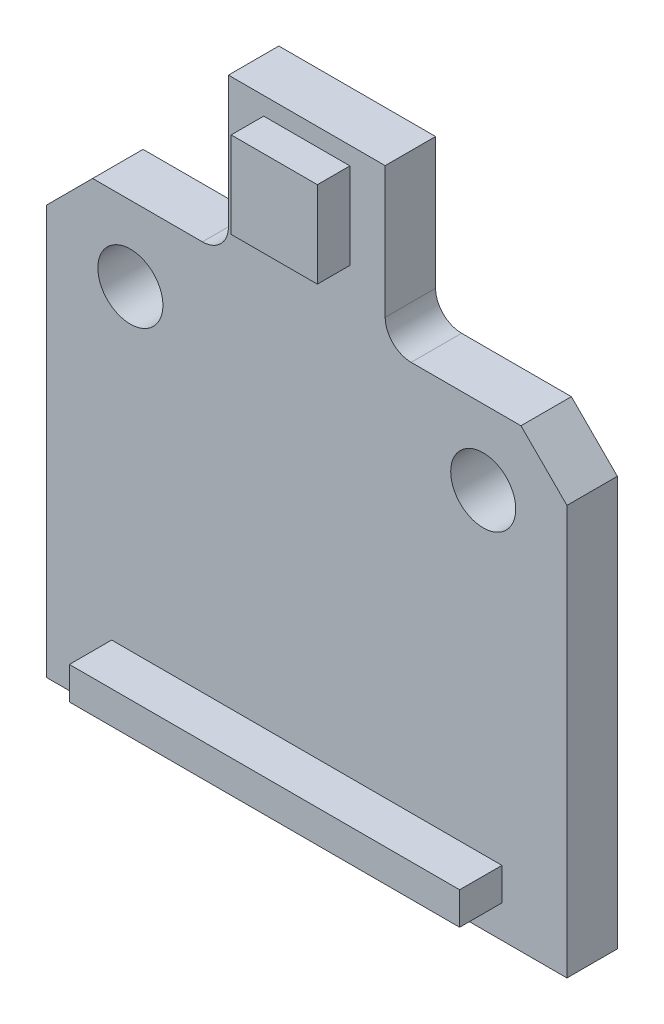
ISO-10303-21;
HEADER;
FILE_DESCRIPTION(('STEP AP214'),'2;1');
FILE_NAME('part.step','',(''),(''),'','','');
FILE_SCHEMA(('AUTOMOTIVE_DESIGN { 1 0 10303 214 1 1 1 1 }'));
ENDSEC;
DATA;
#1=APPLICATION_CONTEXT('core data for automotive mechanical design processes');
#2=APPLICATION_PROTOCOL_DEFINITION('international standard','automotive_design',2000,#1);
#3=PRODUCT_CONTEXT('',#1,'mechanical');
#4=PRODUCT('Part','Part','',(#3));
#5=PRODUCT_RELATED_PRODUCT_CATEGORY('part','',(#4));
#6=PRODUCT_DEFINITION_FORMATION('','',#4);
#7=PRODUCT_DEFINITION_CONTEXT('part definition',#1,'design');
#8=PRODUCT_DEFINITION('design','',#6,#7);
#9=PRODUCT_DEFINITION_SHAPE('','',#8);
#10=(LENGTH_UNIT() NAMED_UNIT(*) SI_UNIT(.MILLI.,.METRE.));
#11=(NAMED_UNIT(*) PLANE_ANGLE_UNIT() SI_UNIT($,.RADIAN.));
#12=(NAMED_UNIT(*) SI_UNIT($,.STERADIAN.) SOLID_ANGLE_UNIT());
#13=UNCERTAINTY_MEASURE_WITH_UNIT(LENGTH_MEASURE(1.E-05),#10,'distance_accuracy_value','');
#14=(GEOMETRIC_REPRESENTATION_CONTEXT(3) GLOBAL_UNCERTAINTY_ASSIGNED_CONTEXT((#13)) GLOBAL_UNIT_ASSIGNED_CONTEXT((#10,
#11,#12)) REPRESENTATION_CONTEXT('',''));
#15=CARTESIAN_POINT('',(0.,0.,0.));
#16=DIRECTION('',(0.,0.,1.));
#17=DIRECTION('',(1.,0.,0.));
#18=AXIS2_PLACEMENT_3D('',#15,#16,#17);
#19=CARTESIAN_POINT('',(4.79,14.8,1.55));
#20=DIRECTION('',(0.,0.,1.));
#21=DIRECTION('',(1.,0.,0.));
#22=AXIS2_PLACEMENT_3D('',#19,#20,#21);
#23=PLANE('',#22);
#24=CARTESIAN_POINT('',(2.575,11.7,1.55));
#25=DIRECTION('',(0.,0.,1.));
#26=DIRECTION('',(1.,0.,0.));
#27=AXIS2_PLACEMENT_3D('',#24,#25,#26);
#28=CIRCLE('',#27,1.);
#29=CARTESIAN_POINT('',(1.575,11.7,1.55));
#30=VERTEX_POINT('',#29);
#31=EDGE_CURVE('E260',#30,#30,#28,.T.);
#32=ORIENTED_EDGE('',*,*,#31,.F.);
#33=EDGE_LOOP('',(#32));
#34=FACE_BOUND('',#33,.T.);
#35=DIRECTION('',(0.,-1.,0.));
#36=VECTOR('',#35,1.);
#37=CARTESIAN_POINT('',(0.,0.,1.55));
#38=LINE('',#37,#36);
#39=CARTESIAN_POINT('',(0.,12.5857864376269,1.55));
#40=VERTEX_POINT('',#39);
#41=CARTESIAN_POINT('',(0.,0.,1.55));
#42=VERTEX_POINT('',#41);
#43=EDGE_CURVE('E268',#40,#42,#38,.T.);
#44=ORIENTED_EDGE('',*,*,#43,.T.);
#45=DIRECTION('',(1.,0.,0.));
#46=VECTOR('',#45,1.);
#47=CARTESIAN_POINT('',(0.,0.,1.55));
#48=LINE('',#47,#46);
#49=CARTESIAN_POINT('',(16.,0.,1.55));
#50=VERTEX_POINT('',#49);
#51=EDGE_CURVE('E272',#42,#50,#48,.T.);
#52=ORIENTED_EDGE('',*,*,#51,.T.);
#53=DIRECTION('',(0.,1.,0.));
#54=VECTOR('',#53,1.);
#55=CARTESIAN_POINT('',(16.,0.,1.55));
#56=LINE('',#55,#54);
#57=CARTESIAN_POINT('',(16.,12.5857864376269,1.55));
#58=VERTEX_POINT('',#57);
#59=EDGE_CURVE('E276',#50,#58,#56,.T.);
#60=ORIENTED_EDGE('',*,*,#59,.T.);
#61=DIRECTION('',(-0.707106781186544,0.707106781186551,0.));
#62=VECTOR('',#61,1.);
#63=CARTESIAN_POINT('',(14.5857864376269,14.,1.55));
#64=LINE('',#63,#62);
#65=CARTESIAN_POINT('',(14.5857864376269,14.,1.55));
#66=VERTEX_POINT('',#65);
#67=EDGE_CURVE('E279',#58,#66,#64,.T.);
#68=ORIENTED_EDGE('',*,*,#67,.T.);
#69=DIRECTION('',(-1.,0.,0.));
#70=VECTOR('',#69,1.);
#71=CARTESIAN_POINT('',(11.21,14.,1.55));
#72=LINE('',#71,#70);
#73=CARTESIAN_POINT('',(11.21,14.,1.55));
#74=VERTEX_POINT('',#73);
#75=EDGE_CURVE('E282',#66,#74,#72,.T.);
#76=ORIENTED_EDGE('',*,*,#75,.T.);
#77=CARTESIAN_POINT('',(11.21,14.8,1.55));
#78=DIRECTION('',(0.,0.,-1.));
#79=DIRECTION('',(-1.,0.,0.));
#80=AXIS2_PLACEMENT_3D('',#77,#78,#79);
#81=CIRCLE('',#80,0.799999999999999);
#82=CARTESIAN_POINT('',(10.41,14.8,1.55));
#83=VERTEX_POINT('',#82);
#84=EDGE_CURVE('E285',#74,#83,#81,.T.);
#85=ORIENTED_EDGE('',*,*,#84,.T.);
#86=DIRECTION('',(0.,1.,0.));
#87=VECTOR('',#86,1.);
#88=CARTESIAN_POINT('',(10.41,14.8,1.55));
#89=LINE('',#88,#87);
#90=CARTESIAN_POINT('',(10.41,18.84,1.55));
#91=VERTEX_POINT('',#90);
#92=EDGE_CURVE('E288',#83,#91,#89,.T.);
#93=ORIENTED_EDGE('',*,*,#92,.T.);
#94=DIRECTION('',(-1.,0.,0.));
#95=VECTOR('',#94,1.);
#96=CARTESIAN_POINT('',(5.59000000000001,18.84,1.55));
#97=LINE('',#96,#95);
#98=CARTESIAN_POINT('',(5.59000000000001,18.84,1.55));
#99=VERTEX_POINT('',#98);
#100=EDGE_CURVE('E291',#91,#99,#97,.T.);
#101=ORIENTED_EDGE('',*,*,#100,.T.);
#102=DIRECTION('',(0.,-1.,0.));
#103=VECTOR('',#102,1.);
#104=CARTESIAN_POINT('',(5.59,14.8,1.55));
#105=LINE('',#104,#103);
#106=CARTESIAN_POINT('',(5.59,14.8,1.55));
#107=VERTEX_POINT('',#106);
#108=EDGE_CURVE('E294',#99,#107,#105,.T.);
#109=ORIENTED_EDGE('',*,*,#108,.T.);
#110=CARTESIAN_POINT('',(4.79,14.8,1.55));
#111=DIRECTION('',(0.,0.,-1.));
#112=DIRECTION('',(1.,0.,0.));
#113=AXIS2_PLACEMENT_3D('',#110,#111,#112);
#114=CIRCLE('',#113,0.8);
#115=CARTESIAN_POINT('',(4.79,14.,1.55));
#116=VERTEX_POINT('',#115);
#117=EDGE_CURVE('E297',#107,#116,#114,.T.);
#118=ORIENTED_EDGE('',*,*,#117,.T.);
#119=DIRECTION('',(-1.,0.,0.));
#120=VECTOR('',#119,1.);
#121=CARTESIAN_POINT('',(1.4142135623731,14.,1.55));
#122=LINE('',#121,#120);
#123=CARTESIAN_POINT('',(1.4142135623731,14.,1.55));
#124=VERTEX_POINT('',#123);
#125=EDGE_CURVE('E300',#116,#124,#122,.T.);
#126=ORIENTED_EDGE('',*,*,#125,.T.);
#127=DIRECTION('',(-0.707106781186548,-0.707106781186547,0.));
#128=VECTOR('',#127,1.);
#129=CARTESIAN_POINT('',(0.,12.5857864376269,1.55));
#130=LINE('',#129,#128);
#131=EDGE_CURVE('E303',#124,#40,#130,.T.);
#132=ORIENTED_EDGE('',*,*,#131,.T.);
#133=EDGE_LOOP('',(#44,#52,#60,#68,#76,#85,#93,#101,#109,#118,#126,#132));
#134=FACE_BOUND('',#133,.T.);
#135=CARTESIAN_POINT('',(13.425,11.7,1.55));
#136=DIRECTION('',(0.,0.,1.));
#137=DIRECTION('',(1.,0.,0.));
#138=AXIS2_PLACEMENT_3D('',#135,#136,#137);
#139=CIRCLE('',#138,1.);
#140=CARTESIAN_POINT('',(12.425,11.7,1.55));
#141=VERTEX_POINT('',#140);
#142=EDGE_CURVE('E252',#141,#141,#139,.T.);
#143=ORIENTED_EDGE('',*,*,#142,.F.);
#144=EDGE_LOOP('',(#143));
#145=FACE_BOUND('',#144,.T.);
#146=DIRECTION('',(1.,0.,0.));
#147=VECTOR('',#146,1.);
#148=CARTESIAN_POINT('',(6.67500000000001,15.64,1.55));
#149=LINE('',#148,#147);
#150=CARTESIAN_POINT('',(6.67500000000001,15.64,1.55));
#151=VERTEX_POINT('',#150);
#152=CARTESIAN_POINT('',(9.32500000000001,15.64,1.55));
#153=VERTEX_POINT('',#152);
#154=EDGE_CURVE('E212',#151,#153,#149,.T.);
#155=ORIENTED_EDGE('',*,*,#154,.F.);
#156=DIRECTION('',(0.,-1.,0.));
#157=VECTOR('',#156,1.);
#158=CARTESIAN_POINT('',(6.67500000000001,18.29,1.55));
#159=LINE('',#158,#157);
#160=CARTESIAN_POINT('',(6.67500000000001,18.29,1.55));
#161=VERTEX_POINT('',#160);
#162=EDGE_CURVE('E207',#161,#151,#159,.T.);
#163=ORIENTED_EDGE('',*,*,#162,.F.);
#164=DIRECTION('',(-1.,0.,0.));
#165=VECTOR('',#164,1.);
#166=CARTESIAN_POINT('',(6.67500000000001,18.29,1.55));
#167=LINE('',#166,#165);
#168=CARTESIAN_POINT('',(9.32500000000001,18.29,1.55));
#169=VERTEX_POINT('',#168);
#170=EDGE_CURVE('E222',#169,#161,#167,.T.);
#171=ORIENTED_EDGE('',*,*,#170,.F.);
#172=DIRECTION('',(0.,1.,0.));
#173=VECTOR('',#172,1.);
#174=CARTESIAN_POINT('',(9.32500000000001,18.29,1.55));
#175=LINE('',#174,#173);
#176=EDGE_CURVE('E234',#153,#169,#175,.T.);
#177=ORIENTED_EDGE('',*,*,#176,.F.);
#178=EDGE_LOOP('',(#155,#163,#171,#177));
#179=FACE_BOUND('',#178,.T.);
#180=DIRECTION('',(1.,0.,0.));
#181=VECTOR('',#180,1.);
#182=CARTESIAN_POINT('',(2.,1.,1.55));
#183=LINE('',#182,#181);
#184=CARTESIAN_POINT('',(2.,1.,1.55));
#185=VERTEX_POINT('',#184);
#186=CARTESIAN_POINT('',(14.,1.,1.55));
#187=VERTEX_POINT('',#186);
#188=EDGE_CURVE('E677',#185,#187,#183,.T.);
#189=ORIENTED_EDGE('',*,*,#188,.F.);
#190=DIRECTION('',(0.,-1.,0.));
#191=VECTOR('',#190,1.);
#192=CARTESIAN_POINT('',(2.,2.,1.55));
#193=LINE('',#192,#191);
#194=CARTESIAN_POINT('',(2.,2.,1.55));
#195=VERTEX_POINT('',#194);
#196=EDGE_CURVE('E204',#195,#185,#193,.T.);
#197=ORIENTED_EDGE('',*,*,#196,.F.);
#198=DIRECTION('',(-1.,0.,0.));
#199=VECTOR('',#198,1.);
#200=CARTESIAN_POINT('',(2.,2.,1.55));
#201=LINE('',#200,#199);
#202=CARTESIAN_POINT('',(14.,2.,1.55));
#203=VERTEX_POINT('',#202);
#204=EDGE_CURVE('E200',#203,#195,#201,.T.);
#205=ORIENTED_EDGE('',*,*,#204,.F.);
#206=DIRECTION('',(0.,1.,0.));
#207=VECTOR('',#206,1.);
#208=CARTESIAN_POINT('',(14.,2.,1.55));
#209=LINE('',#208,#207);
#210=EDGE_CURVE('E673',#187,#203,#209,.T.);
#211=ORIENTED_EDGE('',*,*,#210,.F.);
#212=EDGE_LOOP('',(#189,#197,#205,#211));
#213=FACE_BOUND('',#212,.T.);
#214=ADVANCED_FACE('F40',(#34,#134,#145,#179,#213),#23,.T.);
#215=CARTESIAN_POINT('',(4.79,14.8,0.));
#216=DIRECTION('',(0.,0.,1.));
#217=DIRECTION('',(1.,0.,0.));
#218=AXIS2_PLACEMENT_3D('',#215,#216,#217);
#219=PLANE('',#218);
#220=DIRECTION('',(0.,-1.,0.));
#221=VECTOR('',#220,1.);
#222=CARTESIAN_POINT('',(0.,0.,0.));
#223=LINE('',#222,#221);
#224=CARTESIAN_POINT('',(0.,12.5857864376269,0.));
#225=VERTEX_POINT('',#224);
#226=CARTESIAN_POINT('',(0.,0.,0.));
#227=VERTEX_POINT('',#226);
#228=EDGE_CURVE('E264',#225,#227,#223,.T.);
#229=ORIENTED_EDGE('',*,*,#228,.F.);
#230=DIRECTION('',(-0.707106781186548,-0.707106781186547,0.));
#231=VECTOR('',#230,1.);
#232=CARTESIAN_POINT('',(0.,12.5857864376269,0.));
#233=LINE('',#232,#231);
#234=CARTESIAN_POINT('',(1.4142135623731,14.,0.));
#235=VERTEX_POINT('',#234);
#236=EDGE_CURVE('E273',#235,#225,#233,.T.);
#237=ORIENTED_EDGE('',*,*,#236,.F.);
#238=DIRECTION('',(-1.,0.,0.));
#239=VECTOR('',#238,1.);
#240=CARTESIAN_POINT('',(1.4142135623731,14.,0.));
#241=LINE('',#240,#239);
#242=CARTESIAN_POINT('',(4.79,14.,0.));
#243=VERTEX_POINT('',#242);
#244=EDGE_CURVE('E337',#243,#235,#241,.T.);
#245=ORIENTED_EDGE('',*,*,#244,.F.);
#246=CARTESIAN_POINT('',(4.79,14.8,0.));
#247=DIRECTION('',(0.,0.,-1.));
#248=DIRECTION('',(1.,0.,0.));
#249=AXIS2_PLACEMENT_3D('',#246,#247,#248);
#250=CIRCLE('',#249,0.8);
#251=CARTESIAN_POINT('',(5.59,14.8,0.));
#252=VERTEX_POINT('',#251);
#253=EDGE_CURVE('E334',#252,#243,#250,.T.);
#254=ORIENTED_EDGE('',*,*,#253,.F.);
#255=DIRECTION('',(0.,-1.,0.));
#256=VECTOR('',#255,1.);
#257=CARTESIAN_POINT('',(5.59,14.8,0.));
#258=LINE('',#257,#256);
#259=CARTESIAN_POINT('',(5.59000000000001,18.84,0.));
#260=VERTEX_POINT('',#259);
#261=EDGE_CURVE('E331',#260,#252,#258,.T.);
#262=ORIENTED_EDGE('',*,*,#261,.F.);
#263=DIRECTION('',(-1.,0.,0.));
#264=VECTOR('',#263,1.);
#265=CARTESIAN_POINT('',(5.59000000000001,18.84,0.));
#266=LINE('',#265,#264);
#267=CARTESIAN_POINT('',(10.41,18.84,0.));
#268=VERTEX_POINT('',#267);
#269=EDGE_CURVE('E328',#268,#260,#266,.T.);
#270=ORIENTED_EDGE('',*,*,#269,.F.);
#271=DIRECTION('',(0.,1.,0.));
#272=VECTOR('',#271,1.);
#273=CARTESIAN_POINT('',(10.41,14.8,0.));
#274=LINE('',#273,#272);
#275=CARTESIAN_POINT('',(10.41,14.8,0.));
#276=VERTEX_POINT('',#275);
#277=EDGE_CURVE('E325',#276,#268,#274,.T.);
#278=ORIENTED_EDGE('',*,*,#277,.F.);
#279=CARTESIAN_POINT('',(11.21,14.8,0.));
#280=DIRECTION('',(0.,0.,-1.));
#281=DIRECTION('',(-1.,0.,0.));
#282=AXIS2_PLACEMENT_3D('',#279,#280,#281);
#283=CIRCLE('',#282,0.799999999999999);
#284=CARTESIAN_POINT('',(11.21,14.,0.));
#285=VERTEX_POINT('',#284);
#286=EDGE_CURVE('E322',#285,#276,#283,.T.);
#287=ORIENTED_EDGE('',*,*,#286,.F.);
#288=DIRECTION('',(-1.,0.,0.));
#289=VECTOR('',#288,1.);
#290=CARTESIAN_POINT('',(11.21,14.,0.));
#291=LINE('',#290,#289);
#292=CARTESIAN_POINT('',(14.5857864376269,14.,0.));
#293=VERTEX_POINT('',#292);
#294=EDGE_CURVE('E319',#293,#285,#291,.T.);
#295=ORIENTED_EDGE('',*,*,#294,.F.);
#296=DIRECTION('',(-0.707106781186544,0.707106781186551,0.));
#297=VECTOR('',#296,1.);
#298=CARTESIAN_POINT('',(14.5857864376269,14.,0.));
#299=LINE('',#298,#297);
#300=CARTESIAN_POINT('',(16.,12.5857864376269,0.));
#301=VERTEX_POINT('',#300);
#302=EDGE_CURVE('E316',#301,#293,#299,.T.);
#303=ORIENTED_EDGE('',*,*,#302,.F.);
#304=DIRECTION('',(0.,1.,0.));
#305=VECTOR('',#304,1.);
#306=CARTESIAN_POINT('',(16.,0.,0.));
#307=LINE('',#306,#305);
#308=CARTESIAN_POINT('',(16.,0.,0.));
#309=VERTEX_POINT('',#308);
#310=EDGE_CURVE('E313',#309,#301,#307,.T.);
#311=ORIENTED_EDGE('',*,*,#310,.F.);
#312=DIRECTION('',(1.,0.,0.));
#313=VECTOR('',#312,1.);
#314=CARTESIAN_POINT('',(0.,0.,0.));
#315=LINE('',#314,#313);
#316=EDGE_CURVE('E310',#227,#309,#315,.T.);
#317=ORIENTED_EDGE('',*,*,#316,.F.);
#318=EDGE_LOOP('',(#229,#237,#245,#254,#262,#270,#278,#287,#295,#303,#311,#317));
#319=FACE_BOUND('',#318,.T.);
#320=CARTESIAN_POINT('',(2.575,11.7,0.));
#321=DIRECTION('',(0.,0.,1.));
#322=DIRECTION('',(1.,0.,0.));
#323=AXIS2_PLACEMENT_3D('',#320,#321,#322);
#324=CIRCLE('',#323,1.);
#325=CARTESIAN_POINT('',(1.575,11.7,0.));
#326=VERTEX_POINT('',#325);
#327=EDGE_CURVE('E256',#326,#326,#324,.T.);
#328=ORIENTED_EDGE('',*,*,#327,.T.);
#329=EDGE_LOOP('',(#328));
#330=FACE_BOUND('',#329,.T.);
#331=CARTESIAN_POINT('',(13.425,11.7,0.));
#332=DIRECTION('',(0.,0.,1.));
#333=DIRECTION('',(1.,0.,0.));
#334=AXIS2_PLACEMENT_3D('',#331,#332,#333);
#335=CIRCLE('',#334,1.);
#336=CARTESIAN_POINT('',(12.425,11.7,0.));
#337=VERTEX_POINT('',#336);
#338=EDGE_CURVE('E251',#337,#337,#335,.T.);
#339=ORIENTED_EDGE('',*,*,#338,.T.);
#340=EDGE_LOOP('',(#339));
#341=FACE_BOUND('',#340,.T.);
#342=ADVANCED_FACE('F392',(#319,#330,#341),#219,.F.);
#343=CARTESIAN_POINT('',(0.,0.,1.55));
#344=DIRECTION('',(1.,0.,0.));
#345=DIRECTION('',(0.,0.,-1.));
#346=AXIS2_PLACEMENT_3D('',#343,#344,#345);
#347=PLANE('',#346);
#348=ORIENTED_EDGE('',*,*,#228,.T.);
#349=DIRECTION('',(0.,0.,-1.));
#350=VECTOR('',#349,1.);
#351=CARTESIAN_POINT('',(0.,0.,1.55));
#352=LINE('',#351,#350);
#353=EDGE_CURVE('E11',#42,#227,#352,.T.);
#354=ORIENTED_EDGE('',*,*,#353,.F.);
#355=ORIENTED_EDGE('',*,*,#43,.F.);
#356=DIRECTION('',(0.,0.,-1.));
#357=VECTOR('',#356,1.);
#358=CARTESIAN_POINT('',(0.,12.5857864376269,1.55));
#359=LINE('',#358,#357);
#360=EDGE_CURVE('E306',#40,#225,#359,.T.);
#361=ORIENTED_EDGE('',*,*,#360,.T.);
#362=EDGE_LOOP('',(#348,#354,#355,#361));
#363=FACE_BOUND('',#362,.T.);
#364=ADVANCED_FACE('F42',(#363),#347,.F.);
#365=CARTESIAN_POINT('',(0.,0.,1.55));
#366=DIRECTION('',(0.,1.,0.));
#367=DIRECTION('',(0.,0.,1.));
#368=AXIS2_PLACEMENT_3D('',#365,#366,#367);
#369=PLANE('',#368);
#370=ORIENTED_EDGE('',*,*,#316,.T.);
#371=DIRECTION('',(0.,0.,-1.));
#372=VECTOR('',#371,1.);
#373=CARTESIAN_POINT('',(16.,0.,1.55));
#374=LINE('',#373,#372);
#375=EDGE_CURVE('E49',#50,#309,#374,.T.);
#376=ORIENTED_EDGE('',*,*,#375,.F.);
#377=ORIENTED_EDGE('',*,*,#51,.F.);
#378=ORIENTED_EDGE('',*,*,#353,.T.);
#379=EDGE_LOOP('',(#370,#376,#377,#378));
#380=FACE_BOUND('',#379,.T.);
#381=ADVANCED_FACE('F410',(#380),#369,.F.);
#382=CARTESIAN_POINT('',(16.,0.,1.55));
#383=DIRECTION('',(-1.,0.,0.));
#384=DIRECTION('',(0.,0.,1.));
#385=AXIS2_PLACEMENT_3D('',#382,#383,#384);
#386=PLANE('',#385);
#387=ORIENTED_EDGE('',*,*,#310,.T.);
#388=DIRECTION('',(0.,0.,-1.));
#389=VECTOR('',#388,1.);
#390=CARTESIAN_POINT('',(16.,12.5857864376269,1.55));
#391=LINE('',#390,#389);
#392=EDGE_CURVE('E377',#58,#301,#391,.T.);
#393=ORIENTED_EDGE('',*,*,#392,.F.);
#394=ORIENTED_EDGE('',*,*,#59,.F.);
#395=ORIENTED_EDGE('',*,*,#375,.T.);
#396=EDGE_LOOP('',(#387,#393,#394,#395));
#397=FACE_BOUND('',#396,.T.);
#398=ADVANCED_FACE('F386',(#397),#386,.F.);
#399=CARTESIAN_POINT('',(14.5857864376269,14.,1.55));
#400=DIRECTION('',(-0.707106781186551,-0.707106781186544,0.));
#401=DIRECTION('',(0.707106781186544,-0.707106781186551,0.));
#402=AXIS2_PLACEMENT_3D('',#399,#400,#401);
#403=PLANE('',#402);
#404=ORIENTED_EDGE('',*,*,#302,.T.);
#405=DIRECTION('',(0.,0.,-1.));
#406=VECTOR('',#405,1.);
#407=CARTESIAN_POINT('',(14.5857864376269,14.,1.55));
#408=LINE('',#407,#406);
#409=EDGE_CURVE('E373',#66,#293,#408,.T.);
#410=ORIENTED_EDGE('',*,*,#409,.F.);
#411=ORIENTED_EDGE('',*,*,#67,.F.);
#412=ORIENTED_EDGE('',*,*,#392,.T.);
#413=EDGE_LOOP('',(#404,#410,#411,#412));
#414=FACE_BOUND('',#413,.T.);
#415=ADVANCED_FACE('F398',(#414),#403,.F.);
#416=CARTESIAN_POINT('',(11.21,14.,1.55));
#417=DIRECTION('',(0.,-1.,0.));
#418=DIRECTION('',(0.,0.,-1.));
#419=AXIS2_PLACEMENT_3D('',#416,#417,#418);
#420=PLANE('',#419);
#421=ORIENTED_EDGE('',*,*,#294,.T.);
#422=DIRECTION('',(0.,0.,-1.));
#423=VECTOR('',#422,1.);
#424=CARTESIAN_POINT('',(11.21,14.,1.55));
#425=LINE('',#424,#423);
#426=EDGE_CURVE('E369',#74,#285,#425,.T.);
#427=ORIENTED_EDGE('',*,*,#426,.F.);
#428=ORIENTED_EDGE('',*,*,#75,.F.);
#429=ORIENTED_EDGE('',*,*,#409,.T.);
#430=EDGE_LOOP('',(#421,#427,#428,#429));
#431=FACE_BOUND('',#430,.T.);
#432=ADVANCED_FACE('F402',(#431),#420,.F.);
#433=CARTESIAN_POINT('',(11.21,14.8,1.55));
#434=DIRECTION('',(0.,0.,-1.));
#435=DIRECTION('',(-1.,0.,0.));
#436=AXIS2_PLACEMENT_3D('',#433,#434,#435);
#437=CYLINDRICAL_SURFACE('',#436,0.799999999999999);
#438=ORIENTED_EDGE('',*,*,#286,.T.);
#439=DIRECTION('',(0.,0.,-1.));
#440=VECTOR('',#439,1.);
#441=CARTESIAN_POINT('',(10.41,14.8,1.55));
#442=LINE('',#441,#440);
#443=EDGE_CURVE('E365',#83,#276,#442,.T.);
#444=ORIENTED_EDGE('',*,*,#443,.F.);
#445=ORIENTED_EDGE('',*,*,#84,.F.);
#446=ORIENTED_EDGE('',*,*,#426,.T.);
#447=EDGE_LOOP('',(#438,#444,#445,#446));
#448=FACE_BOUND('',#447,.T.);
#449=ADVANCED_FACE('F443',(#448),#437,.F.);
#450=CARTESIAN_POINT('',(10.41,14.8,1.55));
#451=DIRECTION('',(-1.,0.,0.));
#452=DIRECTION('',(0.,-1.,0.));
#453=AXIS2_PLACEMENT_3D('',#450,#451,#452);
#454=PLANE('',#453);
#455=ORIENTED_EDGE('',*,*,#277,.T.);
#456=DIRECTION('',(0.,0.,-1.));
#457=VECTOR('',#456,1.);
#458=CARTESIAN_POINT('',(10.41,18.84,1.55));
#459=LINE('',#458,#457);
#460=EDGE_CURVE('E361',#91,#268,#459,.T.);
#461=ORIENTED_EDGE('',*,*,#460,.F.);
#462=ORIENTED_EDGE('',*,*,#92,.F.);
#463=ORIENTED_EDGE('',*,*,#443,.T.);
#464=EDGE_LOOP('',(#455,#461,#462,#463));
#465=FACE_BOUND('',#464,.T.);
#466=ADVANCED_FACE('F441',(#465),#454,.F.);
#467=CARTESIAN_POINT('',(5.59000000000001,18.84,1.55));
#468=DIRECTION('',(0.,-1.,0.));
#469=DIRECTION('',(0.,0.,-1.));
#470=AXIS2_PLACEMENT_3D('',#467,#468,#469);
#471=PLANE('',#470);
#472=ORIENTED_EDGE('',*,*,#269,.T.);
#473=DIRECTION('',(0.,0.,-1.));
#474=VECTOR('',#473,1.);
#475=CARTESIAN_POINT('',(5.59000000000001,18.84,1.55));
#476=LINE('',#475,#474);
#477=EDGE_CURVE('E357',#99,#260,#476,.T.);
#478=ORIENTED_EDGE('',*,*,#477,.F.);
#479=ORIENTED_EDGE('',*,*,#100,.F.);
#480=ORIENTED_EDGE('',*,*,#460,.T.);
#481=EDGE_LOOP('',(#472,#478,#479,#480));
#482=FACE_BOUND('',#481,.T.);
#483=ADVANCED_FACE('F437',(#482),#471,.F.);
#484=CARTESIAN_POINT('',(5.59,14.8,1.55));
#485=DIRECTION('',(1.,0.,0.));
#486=DIRECTION('',(0.,1.,0.));
#487=AXIS2_PLACEMENT_3D('',#484,#485,#486);
#488=PLANE('',#487);
#489=ORIENTED_EDGE('',*,*,#261,.T.);
#490=DIRECTION('',(0.,0.,-1.));
#491=VECTOR('',#490,1.);
#492=CARTESIAN_POINT('',(5.59,14.8,1.55));
#493=LINE('',#492,#491);
#494=EDGE_CURVE('E353',#107,#252,#493,.T.);
#495=ORIENTED_EDGE('',*,*,#494,.F.);
#496=ORIENTED_EDGE('',*,*,#108,.F.);
#497=ORIENTED_EDGE('',*,*,#477,.T.);
#498=EDGE_LOOP('',(#489,#495,#496,#497));
#499=FACE_BOUND('',#498,.T.);
#500=ADVANCED_FACE('F432',(#499),#488,.F.);
#501=CARTESIAN_POINT('',(4.79,14.8,1.55));
#502=DIRECTION('',(0.,0.,-1.));
#503=DIRECTION('',(-1.,0.,0.));
#504=AXIS2_PLACEMENT_3D('',#501,#502,#503);
#505=CYLINDRICAL_SURFACE('',#504,0.8);
#506=ORIENTED_EDGE('',*,*,#253,.T.);
#507=DIRECTION('',(0.,0.,-1.));
#508=VECTOR('',#507,1.);
#509=CARTESIAN_POINT('',(4.79,14.,1.55));
#510=LINE('',#509,#508);
#511=EDGE_CURVE('E349',#116,#243,#510,.T.);
#512=ORIENTED_EDGE('',*,*,#511,.F.);
#513=ORIENTED_EDGE('',*,*,#117,.F.);
#514=ORIENTED_EDGE('',*,*,#494,.T.);
#515=EDGE_LOOP('',(#506,#512,#513,#514));
#516=FACE_BOUND('',#515,.T.);
#517=ADVANCED_FACE('F426',(#516),#505,.F.);
#518=CARTESIAN_POINT('',(1.4142135623731,14.,1.55));
#519=DIRECTION('',(0.,-1.,0.));
#520=DIRECTION('',(1.,0.,0.));
#521=AXIS2_PLACEMENT_3D('',#518,#519,#520);
#522=PLANE('',#521);
#523=ORIENTED_EDGE('',*,*,#244,.T.);
#524=DIRECTION('',(0.,0.,-1.));
#525=VECTOR('',#524,1.);
#526=CARTESIAN_POINT('',(1.4142135623731,14.,1.55));
#527=LINE('',#526,#525);
#528=EDGE_CURVE('E345',#124,#235,#527,.T.);
#529=ORIENTED_EDGE('',*,*,#528,.F.);
#530=ORIENTED_EDGE('',*,*,#125,.F.);
#531=ORIENTED_EDGE('',*,*,#511,.T.);
#532=EDGE_LOOP('',(#523,#529,#530,#531));
#533=FACE_BOUND('',#532,.T.);
#534=ADVANCED_FACE('F422',(#533),#522,.F.);
#535=CARTESIAN_POINT('',(0.,12.5857864376269,1.55));
#536=DIRECTION('',(0.707106781186547,-0.707106781186548,0.));
#537=DIRECTION('',(0.707106781186548,0.707106781186547,0.));
#538=AXIS2_PLACEMENT_3D('',#535,#536,#537);
#539=PLANE('',#538);
#540=ORIENTED_EDGE('',*,*,#236,.T.);
#541=ORIENTED_EDGE('',*,*,#360,.F.);
#542=ORIENTED_EDGE('',*,*,#131,.F.);
#543=ORIENTED_EDGE('',*,*,#528,.T.);
#544=EDGE_LOOP('',(#540,#541,#542,#543));
#545=FACE_BOUND('',#544,.T.);
#546=ADVANCED_FACE('F417',(#545),#539,.F.);
#547=CARTESIAN_POINT('',(2.575,11.7,1.55));
#548=DIRECTION('',(0.,0.,-1.));
#549=DIRECTION('',(-1.,0.,0.));
#550=AXIS2_PLACEMENT_3D('',#547,#548,#549);
#551=CYLINDRICAL_SURFACE('',#550,1.);
#552=CARTESIAN_POINT('',(1.575,11.7,1.55));
#553=CARTESIAN_POINT('',(1.575,11.7,1.53385416666667));
#554=CARTESIAN_POINT('',(1.575,11.7,1.51770833333333));
#555=CARTESIAN_POINT('',(1.575,11.7,1.48541666666667));
#556=CARTESIAN_POINT('',(1.575,11.7,1.46927083333333));
#557=CARTESIAN_POINT('',(1.575,11.7,1.43697916666667));
#558=CARTESIAN_POINT('',(1.575,11.7,1.42083333333333));
#559=CARTESIAN_POINT('',(1.575,11.7,1.38854166666667));
#560=CARTESIAN_POINT('',(1.575,11.7,1.37239583333333));
#561=CARTESIAN_POINT('',(1.575,11.7,1.34010416666667));
#562=CARTESIAN_POINT('',(1.575,11.7,1.32395833333333));
#563=CARTESIAN_POINT('',(1.575,11.7,1.29166666666667));
#564=CARTESIAN_POINT('',(1.575,11.7,1.27552083333333));
#565=CARTESIAN_POINT('',(1.575,11.7,1.24322916666667));
#566=CARTESIAN_POINT('',(1.575,11.7,1.22708333333333));
#567=CARTESIAN_POINT('',(1.575,11.7,1.19479166666667));
#568=CARTESIAN_POINT('',(1.575,11.7,1.17864583333333));
#569=CARTESIAN_POINT('',(1.575,11.7,1.14635416666667));
#570=CARTESIAN_POINT('',(1.575,11.7,1.13020833333333));
#571=CARTESIAN_POINT('',(1.575,11.7,1.09791666666667));
#572=CARTESIAN_POINT('',(1.575,11.7,1.08177083333333));
#573=CARTESIAN_POINT('',(1.575,11.7,1.04947916666667));
#574=CARTESIAN_POINT('',(1.575,11.7,1.03333333333333));
#575=CARTESIAN_POINT('',(1.575,11.7,1.00104166666667));
#576=CARTESIAN_POINT('',(1.575,11.7,0.984895833333333));
#577=CARTESIAN_POINT('',(1.575,11.7,0.952604166666667));
#578=CARTESIAN_POINT('',(1.575,11.7,0.936458333333333));
#579=CARTESIAN_POINT('',(1.575,11.7,0.904166666666667));
#580=CARTESIAN_POINT('',(1.575,11.7,0.888020833333333));
#581=CARTESIAN_POINT('',(1.575,11.7,0.855729166666667));
#582=CARTESIAN_POINT('',(1.575,11.7,0.839583333333333));
#583=CARTESIAN_POINT('',(1.575,11.7,0.807291666666667));
#584=CARTESIAN_POINT('',(1.575,11.7,0.791145833333333));
#585=CARTESIAN_POINT('',(1.575,11.7,0.758854166666667));
#586=CARTESIAN_POINT('',(1.575,11.7,0.742708333333333));
#587=CARTESIAN_POINT('',(1.575,11.7,0.710416666666667));
#588=CARTESIAN_POINT('',(1.575,11.7,0.694270833333333));
#589=CARTESIAN_POINT('',(1.575,11.7,0.661979166666667));
#590=CARTESIAN_POINT('',(1.575,11.7,0.645833333333333));
#591=CARTESIAN_POINT('',(1.575,11.7,0.613541666666667));
#592=CARTESIAN_POINT('',(1.575,11.7,0.597395833333333));
#593=CARTESIAN_POINT('',(1.575,11.7,0.565104166666667));
#594=CARTESIAN_POINT('',(1.575,11.7,0.548958333333333));
#595=CARTESIAN_POINT('',(1.575,11.7,0.516666666666667));
#596=CARTESIAN_POINT('',(1.575,11.7,0.500520833333333));
#597=CARTESIAN_POINT('',(1.575,11.7,0.468229166666667));
#598=CARTESIAN_POINT('',(1.575,11.7,0.452083333333333));
#599=CARTESIAN_POINT('',(1.575,11.7,0.419791666666667));
#600=CARTESIAN_POINT('',(1.575,11.7,0.403645833333333));
#601=CARTESIAN_POINT('',(1.575,11.7,0.371354166666667));
#602=CARTESIAN_POINT('',(1.575,11.7,0.355208333333333));
#603=CARTESIAN_POINT('',(1.575,11.7,0.322916666666667));
#604=CARTESIAN_POINT('',(1.575,11.7,0.306770833333333));
#605=CARTESIAN_POINT('',(1.575,11.7,0.274479166666667));
#606=CARTESIAN_POINT('',(1.575,11.7,0.258333333333333));
#607=CARTESIAN_POINT('',(1.575,11.7,0.226041666666667));
#608=CARTESIAN_POINT('',(1.575,11.7,0.209895833333333));
#609=CARTESIAN_POINT('',(1.575,11.7,0.177604166666667));
#610=CARTESIAN_POINT('',(1.575,11.7,0.161458333333333));
#611=CARTESIAN_POINT('',(1.575,11.7,0.129166666666667));
#612=CARTESIAN_POINT('',(1.575,11.7,0.113020833333333));
#613=CARTESIAN_POINT('',(1.575,11.7,0.0807291666666667));
#614=CARTESIAN_POINT('',(1.575,11.7,0.0645833333333334));
#615=CARTESIAN_POINT('',(1.575,11.7,0.0322916666666667));
#616=CARTESIAN_POINT('',(1.575,11.7,0.0161458333333334));
#617=CARTESIAN_POINT('',(1.575,11.7,0.));
#618=B_SPLINE_CURVE_WITH_KNOTS('',3,(#552,#553,#554,#555,#556,#557,#558,#559,#560,#561,#562,
#563,#564,#565,#566,#567,#568,#569,#570,#571,#572,#573,#574,#575,#576,#577,#578,#579,#580,#581,
#582,#583,#584,#585,#586,#587,#588,#589,#590,#591,#592,#593,#594,#595,#596,#597,#598,#599,#600,
#601,#602,#603,#604,#605,#606,#607,#608,#609,#610,#611,#612,#613,#614,#615,#616,#617),
.UNSPECIFIED.,.F.,.F.,(4,2,2,2,2,2,2,2,2,2,2,2,2,2,2,2,2,2,2,2,2,2,2,2,2,2,2,2,2,2,2,2,4),(0.,
0.0484375000000001,0.0968750000000002,0.1453125,0.19375,0.2421875,0.290625,0.3390625,0.3875,
0.4359375,0.484375,0.5328125,0.58125,0.6296875,0.678125,0.7265625,0.775,0.8234375,0.871875,
0.9203125,0.96875,1.0171875,1.065625,1.1140625,1.1625,1.2109375,1.259375,1.3078125,1.35625,
1.4046875,1.453125,1.5015625,1.55),.UNSPECIFIED.);
#619=EDGE_CURVE('BSEAM461',#30,#326,#618,.T.);
#620=ORIENTED_EDGE('',*,*,#31,.T.);
#621=ORIENTED_EDGE('',*,*,#327,.F.);
#622=ORIENTED_EDGE('',*,*,#619,.T.);
#623=ORIENTED_EDGE('',*,*,#619,.F.);
#624=EDGE_LOOP('',(#620,#622,#621,#623));
#625=FACE_BOUND('',#624,.T.);
#626=ADVANCED_FACE('F461',(#625),#551,.F.);
#627=CARTESIAN_POINT('',(13.425,11.7,1.55));
#628=DIRECTION('',(0.,0.,-1.));
#629=DIRECTION('',(-1.,0.,0.));
#630=AXIS2_PLACEMENT_3D('',#627,#628,#629);
#631=CYLINDRICAL_SURFACE('',#630,1.);
#632=CARTESIAN_POINT('',(12.425,11.7,1.55));
#633=CARTESIAN_POINT('',(12.425,11.7,1.53385416666667));
#634=CARTESIAN_POINT('',(12.425,11.7,1.51770833333333));
#635=CARTESIAN_POINT('',(12.425,11.7,1.48541666666667));
#636=CARTESIAN_POINT('',(12.425,11.7,1.46927083333333));
#637=CARTESIAN_POINT('',(12.425,11.7,1.43697916666667));
#638=CARTESIAN_POINT('',(12.425,11.7,1.42083333333333));
#639=CARTESIAN_POINT('',(12.425,11.7,1.38854166666667));
#640=CARTESIAN_POINT('',(12.425,11.7,1.37239583333333));
#641=CARTESIAN_POINT('',(12.425,11.7,1.34010416666667));
#642=CARTESIAN_POINT('',(12.425,11.7,1.32395833333333));
#643=CARTESIAN_POINT('',(12.425,11.7,1.29166666666667));
#644=CARTESIAN_POINT('',(12.425,11.7,1.27552083333333));
#645=CARTESIAN_POINT('',(12.425,11.7,1.24322916666667));
#646=CARTESIAN_POINT('',(12.425,11.7,1.22708333333333));
#647=CARTESIAN_POINT('',(12.425,11.7,1.19479166666667));
#648=CARTESIAN_POINT('',(12.425,11.7,1.17864583333333));
#649=CARTESIAN_POINT('',(12.425,11.7,1.14635416666667));
#650=CARTESIAN_POINT('',(12.425,11.7,1.13020833333333));
#651=CARTESIAN_POINT('',(12.425,11.7,1.09791666666667));
#652=CARTESIAN_POINT('',(12.425,11.7,1.08177083333333));
#653=CARTESIAN_POINT('',(12.425,11.7,1.04947916666667));
#654=CARTESIAN_POINT('',(12.425,11.7,1.03333333333333));
#655=CARTESIAN_POINT('',(12.425,11.7,1.00104166666667));
#656=CARTESIAN_POINT('',(12.425,11.7,0.984895833333333));
#657=CARTESIAN_POINT('',(12.425,11.7,0.952604166666667));
#658=CARTESIAN_POINT('',(12.425,11.7,0.936458333333333));
#659=CARTESIAN_POINT('',(12.425,11.7,0.904166666666667));
#660=CARTESIAN_POINT('',(12.425,11.7,0.888020833333333));
#661=CARTESIAN_POINT('',(12.425,11.7,0.855729166666667));
#662=CARTESIAN_POINT('',(12.425,11.7,0.839583333333333));
#663=CARTESIAN_POINT('',(12.425,11.7,0.807291666666667));
#664=CARTESIAN_POINT('',(12.425,11.7,0.791145833333333));
#665=CARTESIAN_POINT('',(12.425,11.7,0.758854166666667));
#666=CARTESIAN_POINT('',(12.425,11.7,0.742708333333333));
#667=CARTESIAN_POINT('',(12.425,11.7,0.710416666666667));
#668=CARTESIAN_POINT('',(12.425,11.7,0.694270833333333));
#669=CARTESIAN_POINT('',(12.425,11.7,0.661979166666667));
#670=CARTESIAN_POINT('',(12.425,11.7,0.645833333333333));
#671=CARTESIAN_POINT('',(12.425,11.7,0.613541666666667));
#672=CARTESIAN_POINT('',(12.425,11.7,0.597395833333333));
#673=CARTESIAN_POINT('',(12.425,11.7,0.565104166666667));
#674=CARTESIAN_POINT('',(12.425,11.7,0.548958333333333));
#675=CARTESIAN_POINT('',(12.425,11.7,0.516666666666667));
#676=CARTESIAN_POINT('',(12.425,11.7,0.500520833333333));
#677=CARTESIAN_POINT('',(12.425,11.7,0.468229166666667));
#678=CARTESIAN_POINT('',(12.425,11.7,0.452083333333333));
#679=CARTESIAN_POINT('',(12.425,11.7,0.419791666666667));
#680=CARTESIAN_POINT('',(12.425,11.7,0.403645833333333));
#681=CARTESIAN_POINT('',(12.425,11.7,0.371354166666667));
#682=CARTESIAN_POINT('',(12.425,11.7,0.355208333333333));
#683=CARTESIAN_POINT('',(12.425,11.7,0.322916666666667));
#684=CARTESIAN_POINT('',(12.425,11.7,0.306770833333333));
#685=CARTESIAN_POINT('',(12.425,11.7,0.274479166666667));
#686=CARTESIAN_POINT('',(12.425,11.7,0.258333333333333));
#687=CARTESIAN_POINT('',(12.425,11.7,0.226041666666667));
#688=CARTESIAN_POINT('',(12.425,11.7,0.209895833333333));
#689=CARTESIAN_POINT('',(12.425,11.7,0.177604166666667));
#690=CARTESIAN_POINT('',(12.425,11.7,0.161458333333333));
#691=CARTESIAN_POINT('',(12.425,11.7,0.129166666666667));
#692=CARTESIAN_POINT('',(12.425,11.7,0.113020833333333));
#693=CARTESIAN_POINT('',(12.425,11.7,0.0807291666666667));
#694=CARTESIAN_POINT('',(12.425,11.7,0.0645833333333334));
#695=CARTESIAN_POINT('',(12.425,11.7,0.0322916666666667));
#696=CARTESIAN_POINT('',(12.425,11.7,0.0161458333333334));
#697=CARTESIAN_POINT('',(12.425,11.7,0.));
#698=B_SPLINE_CURVE_WITH_KNOTS('',3,(#632,#633,#634,#635,#636,#637,#638,#639,#640,#641,#642,
#643,#644,#645,#646,#647,#648,#649,#650,#651,#652,#653,#654,#655,#656,#657,#658,#659,#660,#661,
#662,#663,#664,#665,#666,#667,#668,#669,#670,#671,#672,#673,#674,#675,#676,#677,#678,#679,#680,
#681,#682,#683,#684,#685,#686,#687,#688,#689,#690,#691,#692,#693,#694,#695,#696,#697),
.UNSPECIFIED.,.F.,.F.,(4,2,2,2,2,2,2,2,2,2,2,2,2,2,2,2,2,2,2,2,2,2,2,2,2,2,2,2,2,2,2,2,4),(0.,
0.0484375000000001,0.0968750000000002,0.1453125,0.19375,0.2421875,0.290625,0.3390625,0.3875,
0.4359375,0.484375,0.5328125,0.58125,0.6296875,0.678125,0.7265625,0.775,0.8234375,0.871875,
0.9203125,0.96875,1.0171875,1.065625,1.1140625,1.1625,1.2109375,1.259375,1.3078125,1.35625,
1.4046875,1.453125,1.5015625,1.55),.UNSPECIFIED.);
#699=EDGE_CURVE('BSEAM499',#141,#337,#698,.T.);
#700=ORIENTED_EDGE('',*,*,#142,.T.);
#701=ORIENTED_EDGE('',*,*,#338,.F.);
#702=ORIENTED_EDGE('',*,*,#699,.T.);
#703=ORIENTED_EDGE('',*,*,#699,.F.);
#704=EDGE_LOOP('',(#700,#702,#701,#703));
#705=FACE_BOUND('',#704,.T.);
#706=ADVANCED_FACE('F499',(#705),#631,.F.);
#707=CARTESIAN_POINT('',(6.67500000000001,18.29,2.55));
#708=DIRECTION('',(1.,0.,0.));
#709=DIRECTION('',(0.,0.,-1.));
#710=AXIS2_PLACEMENT_3D('',#707,#708,#709);
#711=PLANE('',#710);
#712=ORIENTED_EDGE('',*,*,#162,.T.);
#713=DIRECTION('',(0.,0.,-1.));
#714=VECTOR('',#713,1.);
#715=CARTESIAN_POINT('',(6.67500000000001,15.64,2.55));
#716=LINE('',#715,#714);
#717=CARTESIAN_POINT('',(6.67500000000001,15.64,2.55));
#718=VERTEX_POINT('',#717);
#719=EDGE_CURVE('E248',#718,#151,#716,.T.);
#720=ORIENTED_EDGE('',*,*,#719,.F.);
#721=DIRECTION('',(0.,-1.,0.));
#722=VECTOR('',#721,1.);
#723=CARTESIAN_POINT('',(6.67500000000001,18.29,2.55));
#724=LINE('',#723,#722);
#725=CARTESIAN_POINT('',(6.67500000000001,18.29,2.55));
#726=VERTEX_POINT('',#725);
#727=EDGE_CURVE('E217',#726,#718,#724,.T.);
#728=ORIENTED_EDGE('',*,*,#727,.F.);
#729=DIRECTION('',(0.,0.,-1.));
#730=VECTOR('',#729,1.);
#731=CARTESIAN_POINT('',(6.67500000000001,18.29,2.55));
#732=LINE('',#731,#730);
#733=EDGE_CURVE('E230',#726,#161,#732,.T.);
#734=ORIENTED_EDGE('',*,*,#733,.T.);
#735=EDGE_LOOP('',(#712,#720,#728,#734));
#736=FACE_BOUND('',#735,.T.);
#737=ADVANCED_FACE('F506',(#736),#711,.F.);
#738=CARTESIAN_POINT('',(6.67500000000001,15.64,2.55));
#739=DIRECTION('',(0.,1.,0.));
#740=DIRECTION('',(0.,0.,1.));
#741=AXIS2_PLACEMENT_3D('',#738,#739,#740);
#742=PLANE('',#741);
#743=ORIENTED_EDGE('',*,*,#154,.T.);
#744=DIRECTION('',(0.,0.,-1.));
#745=VECTOR('',#744,1.);
#746=CARTESIAN_POINT('',(9.32500000000001,15.64,2.55));
#747=LINE('',#746,#745);
#748=CARTESIAN_POINT('',(9.32500000000001,15.64,2.55));
#749=VERTEX_POINT('',#748);
#750=EDGE_CURVE('E244',#749,#153,#747,.T.);
#751=ORIENTED_EDGE('',*,*,#750,.F.);
#752=DIRECTION('',(1.,0.,0.));
#753=VECTOR('',#752,1.);
#754=CARTESIAN_POINT('',(6.67500000000001,15.64,2.55));
#755=LINE('',#754,#753);
#756=EDGE_CURVE('E221',#718,#749,#755,.T.);
#757=ORIENTED_EDGE('',*,*,#756,.F.);
#758=ORIENTED_EDGE('',*,*,#719,.T.);
#759=EDGE_LOOP('',(#743,#751,#757,#758));
#760=FACE_BOUND('',#759,.T.);
#761=ADVANCED_FACE('F513',(#760),#742,.F.);
#762=CARTESIAN_POINT('',(9.32500000000001,18.29,2.55));
#763=DIRECTION('',(-1.,0.,0.));
#764=DIRECTION('',(0.,0.,1.));
#765=AXIS2_PLACEMENT_3D('',#762,#763,#764);
#766=PLANE('',#765);
#767=ORIENTED_EDGE('',*,*,#176,.T.);
#768=DIRECTION('',(0.,0.,-1.));
#769=VECTOR('',#768,1.);
#770=CARTESIAN_POINT('',(9.32500000000001,18.29,2.55));
#771=LINE('',#770,#769);
#772=CARTESIAN_POINT('',(9.32500000000001,18.29,2.55));
#773=VERTEX_POINT('',#772);
#774=EDGE_CURVE('E64',#773,#169,#771,.T.);
#775=ORIENTED_EDGE('',*,*,#774,.F.);
#776=DIRECTION('',(0.,1.,0.));
#777=VECTOR('',#776,1.);
#778=CARTESIAN_POINT('',(9.32500000000001,18.29,2.55));
#779=LINE('',#778,#777);
#780=EDGE_CURVE('E225',#749,#773,#779,.T.);
#781=ORIENTED_EDGE('',*,*,#780,.F.);
#782=ORIENTED_EDGE('',*,*,#750,.T.);
#783=EDGE_LOOP('',(#767,#775,#781,#782));
#784=FACE_BOUND('',#783,.T.);
#785=ADVANCED_FACE('F521',(#784),#766,.F.);
#786=CARTESIAN_POINT('',(6.67500000000001,18.29,2.55));
#787=DIRECTION('',(0.,-1.,0.));
#788=DIRECTION('',(0.,0.,-1.));
#789=AXIS2_PLACEMENT_3D('',#786,#787,#788);
#790=PLANE('',#789);
#791=ORIENTED_EDGE('',*,*,#170,.T.);
#792=ORIENTED_EDGE('',*,*,#733,.F.);
#793=DIRECTION('',(-1.,0.,0.));
#794=VECTOR('',#793,1.);
#795=CARTESIAN_POINT('',(6.67500000000001,18.29,2.55));
#796=LINE('',#795,#794);
#797=EDGE_CURVE('E228',#773,#726,#796,.T.);
#798=ORIENTED_EDGE('',*,*,#797,.F.);
#799=ORIENTED_EDGE('',*,*,#774,.T.);
#800=EDGE_LOOP('',(#791,#792,#798,#799));
#801=FACE_BOUND('',#800,.T.);
#802=ADVANCED_FACE('F529',(#801),#790,.F.);
#803=CARTESIAN_POINT('',(0.,0.,2.55));
#804=DIRECTION('',(0.,0.,1.));
#805=DIRECTION('',(1.,0.,0.));
#806=AXIS2_PLACEMENT_3D('',#803,#804,#805);
#807=PLANE('',#806);
#808=ORIENTED_EDGE('',*,*,#727,.T.);
#809=ORIENTED_EDGE('',*,*,#756,.T.);
#810=ORIENTED_EDGE('',*,*,#780,.T.);
#811=ORIENTED_EDGE('',*,*,#797,.T.);
#812=EDGE_LOOP('',(#808,#809,#810,#811));
#813=FACE_BOUND('',#812,.T.);
#814=ADVANCED_FACE('F537',(#813),#807,.T.);
#815=CARTESIAN_POINT('',(2.,2.,2.85));
#816=DIRECTION('',(1.,0.,0.));
#817=DIRECTION('',(0.,0.,-1.));
#818=AXIS2_PLACEMENT_3D('',#815,#816,#817);
#819=PLANE('',#818);
#820=ORIENTED_EDGE('',*,*,#196,.T.);
#821=DIRECTION('',(0.,0.,-1.));
#822=VECTOR('',#821,1.);
#823=CARTESIAN_POINT('',(2.,1.,2.85));
#824=LINE('',#823,#822);
#825=CARTESIAN_POINT('',(2.,1.,2.85));
#826=VERTEX_POINT('',#825);
#827=EDGE_CURVE('E183',#826,#185,#824,.T.);
#828=ORIENTED_EDGE('',*,*,#827,.F.);
#829=DIRECTION('',(0.,-1.,0.));
#830=VECTOR('',#829,1.);
#831=CARTESIAN_POINT('',(2.,2.,2.85));
#832=LINE('',#831,#830);
#833=CARTESIAN_POINT('',(2.,2.,2.85));
#834=VERTEX_POINT('',#833);
#835=EDGE_CURVE('E191',#834,#826,#832,.T.);
#836=ORIENTED_EDGE('',*,*,#835,.F.);
#837=DIRECTION('',(0.,0.,-1.));
#838=VECTOR('',#837,1.);
#839=CARTESIAN_POINT('',(2.,2.,2.85));
#840=LINE('',#839,#838);
#841=EDGE_CURVE('E669',#834,#195,#840,.T.);
#842=ORIENTED_EDGE('',*,*,#841,.T.);
#843=EDGE_LOOP('',(#820,#828,#836,#842));
#844=FACE_BOUND('',#843,.T.);
#845=ADVANCED_FACE('F202',(#844),#819,.F.);
#846=CARTESIAN_POINT('',(2.,1.,2.85));
#847=DIRECTION('',(0.,1.,0.));
#848=DIRECTION('',(0.,0.,1.));
#849=AXIS2_PLACEMENT_3D('',#846,#847,#848);
#850=PLANE('',#849);
#851=ORIENTED_EDGE('',*,*,#188,.T.);
#852=DIRECTION('',(0.,0.,-1.));
#853=VECTOR('',#852,1.);
#854=CARTESIAN_POINT('',(14.,1.,2.85));
#855=LINE('',#854,#853);
#856=CARTESIAN_POINT('',(14.,1.,2.85));
#857=VERTEX_POINT('',#856);
#858=EDGE_CURVE('E186',#857,#187,#855,.T.);
#859=ORIENTED_EDGE('',*,*,#858,.F.);
#860=DIRECTION('',(1.,0.,0.));
#861=VECTOR('',#860,1.);
#862=CARTESIAN_POINT('',(2.,1.,2.85));
#863=LINE('',#862,#861);
#864=EDGE_CURVE('E179',#826,#857,#863,.T.);
#865=ORIENTED_EDGE('',*,*,#864,.F.);
#866=ORIENTED_EDGE('',*,*,#827,.T.);
#867=EDGE_LOOP('',(#851,#859,#865,#866));
#868=FACE_BOUND('',#867,.T.);
#869=ADVANCED_FACE('F181',(#868),#850,.F.);
#870=CARTESIAN_POINT('',(14.,2.,2.85));
#871=DIRECTION('',(-1.,0.,0.));
#872=DIRECTION('',(0.,0.,1.));
#873=AXIS2_PLACEMENT_3D('',#870,#871,#872);
#874=PLANE('',#873);
#875=ORIENTED_EDGE('',*,*,#210,.T.);
#876=DIRECTION('',(0.,0.,-1.));
#877=VECTOR('',#876,1.);
#878=CARTESIAN_POINT('',(14.,2.,2.85));
#879=LINE('',#878,#877);
#880=CARTESIAN_POINT('',(14.,2.,2.85));
#881=VERTEX_POINT('',#880);
#882=EDGE_CURVE('E56',#881,#203,#879,.T.);
#883=ORIENTED_EDGE('',*,*,#882,.F.);
#884=DIRECTION('',(0.,1.,0.));
#885=VECTOR('',#884,1.);
#886=CARTESIAN_POINT('',(14.,2.,2.85));
#887=LINE('',#886,#885);
#888=EDGE_CURVE('E190',#857,#881,#887,.T.);
#889=ORIENTED_EDGE('',*,*,#888,.F.);
#890=ORIENTED_EDGE('',*,*,#858,.T.);
#891=EDGE_LOOP('',(#875,#883,#889,#890));
#892=FACE_BOUND('',#891,.T.);
#893=ADVANCED_FACE('F557',(#892),#874,.F.);
#894=CARTESIAN_POINT('',(2.,2.,2.85));
#895=DIRECTION('',(0.,-1.,0.));
#896=DIRECTION('',(0.,0.,-1.));
#897=AXIS2_PLACEMENT_3D('',#894,#895,#896);
#898=PLANE('',#897);
#899=ORIENTED_EDGE('',*,*,#204,.T.);
#900=ORIENTED_EDGE('',*,*,#841,.F.);
#901=DIRECTION('',(-1.,0.,0.));
#902=VECTOR('',#901,1.);
#903=CARTESIAN_POINT('',(2.,2.,2.85));
#904=LINE('',#903,#902);
#905=EDGE_CURVE('E195',#881,#834,#904,.T.);
#906=ORIENTED_EDGE('',*,*,#905,.F.);
#907=ORIENTED_EDGE('',*,*,#882,.T.);
#908=EDGE_LOOP('',(#899,#900,#906,#907));
#909=FACE_BOUND('',#908,.T.);
#910=ADVANCED_FACE('F564',(#909),#898,.F.);
#911=CARTESIAN_POINT('',(0.,0.,2.85));
#912=DIRECTION('',(0.,0.,1.));
#913=DIRECTION('',(1.,0.,0.));
#914=AXIS2_PLACEMENT_3D('',#911,#912,#913);
#915=PLANE('',#914);
#916=ORIENTED_EDGE('',*,*,#835,.T.);
#917=ORIENTED_EDGE('',*,*,#864,.T.);
#918=ORIENTED_EDGE('',*,*,#888,.T.);
#919=ORIENTED_EDGE('',*,*,#905,.T.);
#920=EDGE_LOOP('',(#916,#917,#918,#919));
#921=FACE_BOUND('',#920,.T.);
#922=ADVANCED_FACE('F194',(#921),#915,.T.);
#923=CLOSED_SHELL('',(#214,#342,#364,#381,#398,#415,#432,#449,#466,#483,#500,#517,#534,#546,
#626,#706,#737,#761,#785,#802,#814,#845,#869,#893,#910,#922));
#924=MANIFOLD_SOLID_BREP('B2',#923);
#925=ADVANCED_BREP_SHAPE_REPRESENTATION('',(#18,#924),#14);
#926=SHAPE_DEFINITION_REPRESENTATION(#9,#925);
ENDSEC;
END-ISO-10303-21;
